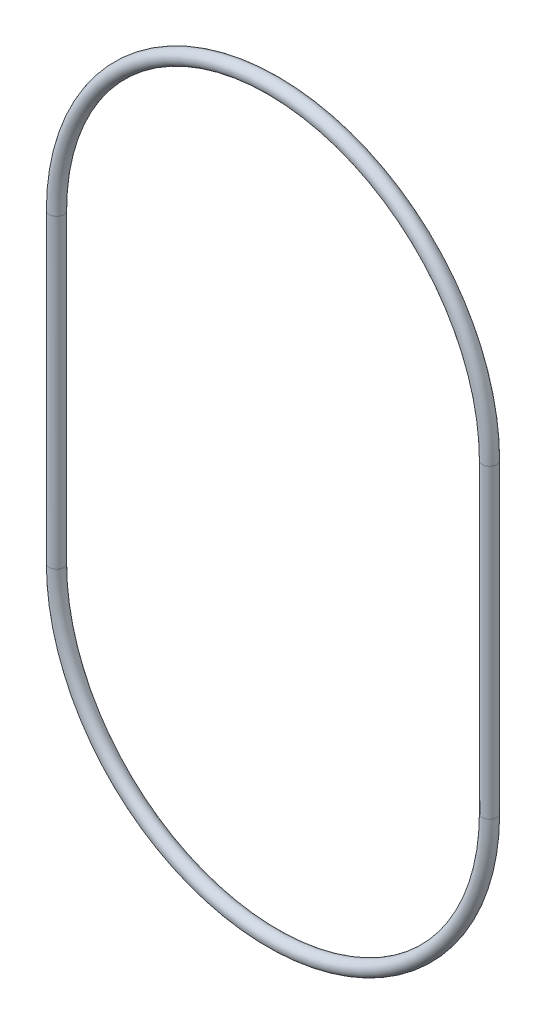
ISO-10303-21;
HEADER;
FILE_DESCRIPTION(('STEP AP214'),'2;1');
FILE_NAME('part.step','',(''),(''),'','','');
FILE_SCHEMA(('AUTOMOTIVE_DESIGN { 1 0 10303 214 1 1 1 1 }'));
ENDSEC;
DATA;
#1=APPLICATION_CONTEXT('core data for automotive mechanical design processes');
#2=APPLICATION_PROTOCOL_DEFINITION('international standard','automotive_design',2000,#1);
#3=PRODUCT_CONTEXT('',#1,'mechanical');
#4=PRODUCT('Part','Part','',(#3));
#5=PRODUCT_RELATED_PRODUCT_CATEGORY('part','',(#4));
#6=PRODUCT_DEFINITION_FORMATION('','',#4);
#7=PRODUCT_DEFINITION_CONTEXT('part definition',#1,'design');
#8=PRODUCT_DEFINITION('design','',#6,#7);
#9=PRODUCT_DEFINITION_SHAPE('','',#8);
#10=(LENGTH_UNIT() NAMED_UNIT(*) SI_UNIT(.MILLI.,.METRE.));
#11=(NAMED_UNIT(*) PLANE_ANGLE_UNIT() SI_UNIT($,.RADIAN.));
#12=(NAMED_UNIT(*) SI_UNIT($,.STERADIAN.) SOLID_ANGLE_UNIT());
#13=UNCERTAINTY_MEASURE_WITH_UNIT(LENGTH_MEASURE(1.E-05),#10,'distance_accuracy_value','');
#14=(GEOMETRIC_REPRESENTATION_CONTEXT(3) GLOBAL_UNCERTAINTY_ASSIGNED_CONTEXT((#13)) GLOBAL_UNIT_ASSIGNED_CONTEXT((#10,
#11,#12)) REPRESENTATION_CONTEXT('',''));
#15=CARTESIAN_POINT('',(0.,0.,0.));
#16=DIRECTION('',(0.,0.,1.));
#17=DIRECTION('',(1.,0.,0.));
#18=AXIS2_PLACEMENT_3D('',#15,#16,#17);
#19=CARTESIAN_POINT('',(0.,0.,0.));
#20=DIRECTION('',(0.,0.,-1.));
#21=DIRECTION('',(-1.,0.,0.));
#22=AXIS2_PLACEMENT_3D('',#19,#20,#21);
#23=TOROIDAL_SURFACE('',#22,34.,1.125);
#24=CARTESIAN_POINT('',(-34.,0.,0.));
#25=DIRECTION('',(0.,-1.,0.));
#26=DIRECTION('',(0.,0.,1.));
#27=AXIS2_PLACEMENT_3D('',#24,#25,#26);
#28=CIRCLE('',#27,1.125);
#29=CARTESIAN_POINT('',(-34.,0.,1.125));
#30=VERTEX_POINT('',#29);
#31=EDGE_CURVE('E41',#30,#30,#28,.T.);
#32=ORIENTED_EDGE('',*,*,#31,.F.);
#33=EDGE_LOOP('',(#32));
#34=FACE_BOUND('',#33,.T.);
#35=CARTESIAN_POINT('',(34.,0.,1.125));
#36=CARTESIAN_POINT('',(34.0184077880435,0.,1.12500039047487));
#37=CARTESIAN_POINT('',(34.0368155428614,0.,1.12454821926579));
#38=CARTESIAN_POINT('',(34.0735867243753,0.,1.12274155719584));
#39=CARTESIAN_POINT('',(34.0919501510712,0.,1.12138706633496));
#40=CARTESIAN_POINT('',(34.1285884146703,0.,1.11777856867748));
#41=CARTESIAN_POINT('',(34.1468632515735,0.,1.11552456188088));
#42=CARTESIAN_POINT('',(34.1832803159511,0.,1.11012258553987));
#43=CARTESIAN_POINT('',(34.2014225434256,0.,1.10697461599545));
#44=CARTESIAN_POINT('',(34.2375306811107,0.,1.09979226491181));
#45=CARTESIAN_POINT('',(34.2554965913212,0.,1.09575788337258));
#46=CARTESIAN_POINT('',(34.2912088134611,0.,1.08681243631514));
#47=CARTESIAN_POINT('',(34.3089551253905,0.,1.08190137079692));
#48=CARTESIAN_POINT('',(34.344185398432,0.,1.07121438460054));
#49=CARTESIAN_POINT('',(34.3616693595441,0.,1.06543846392238));
#50=CARTESIAN_POINT('',(34.3963328105884,0.,1.05303568273941));
#51=CARTESIAN_POINT('',(34.4135123005206,0.,1.04640882223462));
#52=CARTESIAN_POINT('',(34.4475254223008,0.,1.03232012591577));
#53=CARTESIAN_POINT('',(34.4643590541488,0.,1.02485829010173));
#54=CARTESIAN_POINT('',(34.4976399060693,0.,1.00911761942601));
#55=CARTESIAN_POINT('',(34.5140871261417,0.,1.00083878456433));
#56=CARTESIAN_POINT('',(34.5465555317167,0.,0.983484060219461));
#57=CARTESIAN_POINT('',(34.5625767172193,0.,0.974408170736265));
#58=CARTESIAN_POINT('',(34.5941544572155,0.,0.955481201764344));
#59=CARTESIAN_POINT('',(34.6097110117091,0.,0.945630122275619));
#60=CARTESIAN_POINT('',(34.640322012585,0.,0.925176505405105));
#61=CARTESIAN_POINT('',(34.6553764589673,0.,0.914573968023315));
#62=CARTESIAN_POINT('',(34.6849469761407,0.,0.892642977808132));
#63=CARTESIAN_POINT('',(34.6994630469317,0.,0.881314524974739));
#64=CARTESIAN_POINT('',(34.7279218424365,0.,0.857958995091416));
#65=CARTESIAN_POINT('',(34.7418645671503,0.,0.845931918041485));
#66=CARTESIAN_POINT('',(34.7691430812555,0.,0.821208114007168));
#67=CARTESIAN_POINT('',(34.7824788706469,0.,0.808511387022781));
#68=CARTESIAN_POINT('',(34.8085113870228,0.,0.782478870646949));
#69=CARTESIAN_POINT('',(34.8212081140072,0.,0.769143081255504));
#70=CARTESIAN_POINT('',(34.8459319180415,0.,0.741864567150283));
#71=CARTESIAN_POINT('',(34.8579589950914,0.,0.727921842436507));
#72=CARTESIAN_POINT('',(34.8813145249747,0.,0.699463046931693));
#73=CARTESIAN_POINT('',(34.8926429778082,0.,0.684946976140655));
#74=CARTESIAN_POINT('',(34.9145739680233,0.,0.655376458967316));
#75=CARTESIAN_POINT('',(34.9251765054051,0.,0.640322012585014));
#76=CARTESIAN_POINT('',(34.9456301222757,0.,0.60971101170909));
#77=CARTESIAN_POINT('',(34.9554812017645,0.,0.594154457215468));
#78=CARTESIAN_POINT('',(34.9744081707361,0.,0.562576717219277));
#79=CARTESIAN_POINT('',(34.9834840602187,0.,0.546555531716708));
#80=CARTESIAN_POINT('',(35.0008387845651,0.,0.514087126141785));
#81=CARTESIAN_POINT('',(35.0091176194288,0.,0.497639906069431));
#82=CARTESIAN_POINT('',(35.0248582900989,0.,0.464359054148701));
#83=CARTESIAN_POINT('',(35.0323201259054,0.,0.447525422300326));
#84=CARTESIAN_POINT('',(35.046408822245,0.,0.413512300521125));
#85=CARTESIAN_POINT('',(35.0530356827781,0.,0.396332810590301));
#86=CARTESIAN_POINT('',(35.0654384638837,0.,0.361669359542193));
#87=CARTESIAN_POINT('',(35.071214384456,0.,0.34418539842491));
#88=CARTESIAN_POINT('',(35.0819013709414,0.,0.30895512539763));
#89=CARTESIAN_POINT('',(35.0868124368545,0.,0.291208813487633));
#90=CARTESIAN_POINT('',(35.0957578828332,0.,0.25549659129471));
#91=CARTESIAN_POINT('',(35.099792262899,0.,0.237530681011784));
#92=CARTESIAN_POINT('',(35.1069746180083,0.,0.201422543524504));
#93=CARTESIAN_POINT('',(35.1101225930518,0.,0.183280316320148));
#94=CARTESIAN_POINT('',(35.115524554369,0.,0.146863251204415));
#95=CARTESIAN_POINT('',(35.1177785406426,0.,0.128588413293037));
#96=CARTESIAN_POINT('',(35.1213870943698,0.,0.0919501524484736));
#97=CARTESIAN_POINT('',(35.1227416618233,0.,0.0735867295152883));
#98=CARTESIAN_POINT('',(35.1245481146384,0.,0.036815537721402));
#99=CARTESIAN_POINT('',(35.125,0.,0.018407768860701));
#100=CARTESIAN_POINT('',(35.125,0.,-0.018407768860701));
#101=CARTESIAN_POINT('',(35.1245481146384,0.,-0.036815537721402));
#102=CARTESIAN_POINT('',(35.1227416618233,0.,-0.0735867295152883));
#103=CARTESIAN_POINT('',(35.1213870943698,0.,-0.0919501524484736));
#104=CARTESIAN_POINT('',(35.1177785406426,0.,-0.128588413293037));
#105=CARTESIAN_POINT('',(35.115524554369,0.,-0.146863251204415));
#106=CARTESIAN_POINT('',(35.1101225930518,0.,-0.183280316320148));
#107=CARTESIAN_POINT('',(35.1069746180083,0.,-0.201422543524504));
#108=CARTESIAN_POINT('',(35.099792262899,0.,-0.237530681011784));
#109=CARTESIAN_POINT('',(35.0957578828332,0.,-0.25549659129471));
#110=CARTESIAN_POINT('',(35.0868124368545,0.,-0.291208813487633));
#111=CARTESIAN_POINT('',(35.0819013709414,0.,-0.30895512539763));
#112=CARTESIAN_POINT('',(35.071214384456,0.,-0.34418539842491));
#113=CARTESIAN_POINT('',(35.0654384638837,0.,-0.361669359542193));
#114=CARTESIAN_POINT('',(35.0530356827781,0.,-0.396332810590301));
#115=CARTESIAN_POINT('',(35.046408822245,0.,-0.413512300521125));
#116=CARTESIAN_POINT('',(35.0323201259054,0.,-0.447525422300326));
#117=CARTESIAN_POINT('',(35.0248582900989,0.,-0.464359054148701));
#118=CARTESIAN_POINT('',(35.0091176194288,0.,-0.497639906069431));
#119=CARTESIAN_POINT('',(35.0008387845651,0.,-0.514087126141785));
#120=CARTESIAN_POINT('',(34.9834840602187,0.,-0.546555531716708));
#121=CARTESIAN_POINT('',(34.9744081707361,0.,-0.562576717219277));
#122=CARTESIAN_POINT('',(34.9554812017645,0.,-0.594154457215468));
#123=CARTESIAN_POINT('',(34.9456301222757,0.,-0.60971101170909));
#124=CARTESIAN_POINT('',(34.9251765054051,0.,-0.640322012585014));
#125=CARTESIAN_POINT('',(34.9145739680233,0.,-0.655376458967315));
#126=CARTESIAN_POINT('',(34.8926429778082,0.,-0.684946976140655));
#127=CARTESIAN_POINT('',(34.8813145249747,0.,-0.699463046931693));
#128=CARTESIAN_POINT('',(34.8579589950914,0.,-0.727921842436508));
#129=CARTESIAN_POINT('',(34.8459319180415,0.,-0.741864567150283));
#130=CARTESIAN_POINT('',(34.8212081140072,0.,-0.769143081255504));
#131=CARTESIAN_POINT('',(34.8085113870228,0.,-0.782478870646949));
#132=CARTESIAN_POINT('',(34.7824788706469,0.,-0.808511387022781));
#133=CARTESIAN_POINT('',(34.7691430812555,0.,-0.821208114007169));
#134=CARTESIAN_POINT('',(34.7418645671503,0.,-0.845931918041485));
#135=CARTESIAN_POINT('',(34.7279218424365,0.,-0.857958995091412));
#136=CARTESIAN_POINT('',(34.6994630469317,0.,-0.881314524974743));
#137=CARTESIAN_POINT('',(34.6849469761407,0.,-0.892642977808147));
#138=CARTESIAN_POINT('',(34.6553764589673,0.,-0.914573968023301));
#139=CARTESIAN_POINT('',(34.640322012585,0.,-0.925176505405051));
#140=CARTESIAN_POINT('',(34.6097110117091,0.,-0.945630122275673));
#141=CARTESIAN_POINT('',(34.5941544572155,0.,-0.955481201764544));
#142=CARTESIAN_POINT('',(34.5625767172193,0.,-0.974408170736066));
#143=CARTESIAN_POINT('',(34.5465555317167,0.,-0.983484060218716));
#144=CARTESIAN_POINT('',(34.5140871261418,0.,-1.00083878456508));
#145=CARTESIAN_POINT('',(34.4976399060694,0.,-1.00911761942879));
#146=CARTESIAN_POINT('',(34.4643590541487,0.,-1.02485829009895));
#147=CARTESIAN_POINT('',(34.4475254223003,0.,-1.0323201259054));
#148=CARTESIAN_POINT('',(34.4135123005211,0.,-1.04640882224499));
#149=CARTESIAN_POINT('',(34.3963328105903,0.,-1.05303568277814));
#150=CARTESIAN_POINT('',(34.3616693595422,0.,-1.06543846388366));
#151=CARTESIAN_POINT('',(34.3441853984249,0.,-1.07121438445603));
#152=CARTESIAN_POINT('',(34.3089551253976,0.,-1.08190137094144));
#153=CARTESIAN_POINT('',(34.2912088134876,0.,-1.08681243685447));
#154=CARTESIAN_POINT('',(34.2554965912947,0.,-1.09575788283325));
#155=CARTESIAN_POINT('',(34.2375306810118,0.,-1.099792262899));
#156=CARTESIAN_POINT('',(34.2014225435245,0.,-1.10697461800826));
#157=CARTESIAN_POINT('',(34.1832803163202,0.,-1.11012259305178));
#158=CARTESIAN_POINT('',(34.1468632512044,0.,-1.11552455436897));
#159=CARTESIAN_POINT('',(34.128588413293,0.,-1.11777854064265));
#160=CARTESIAN_POINT('',(34.0919501524485,0.,-1.12138709436979));
#161=CARTESIAN_POINT('',(34.0735867295153,0.,-1.12274166182327));
#162=CARTESIAN_POINT('',(34.0368155377214,0.,-1.12454811463837));
#163=CARTESIAN_POINT('',(34.0184077688607,0.,-1.125));
#164=CARTESIAN_POINT('',(33.9815922311393,0.,-1.125));
#165=CARTESIAN_POINT('',(33.9631844622786,0.,-1.12454811463837));
#166=CARTESIAN_POINT('',(33.9264132704847,0.,-1.12274166182327));
#167=CARTESIAN_POINT('',(33.9080498475515,0.,-1.12138709436979));
#168=CARTESIAN_POINT('',(33.871411586707,0.,-1.11777854064265));
#169=CARTESIAN_POINT('',(33.8531367487956,0.,-1.11552455436897));
#170=CARTESIAN_POINT('',(33.8167196836799,0.,-1.11012259305178));
#171=CARTESIAN_POINT('',(33.7985774564755,0.,-1.10697461800826));
#172=CARTESIAN_POINT('',(33.7624693189882,0.,-1.099792262899));
#173=CARTESIAN_POINT('',(33.7445034087053,0.,-1.09575788283325));
#174=CARTESIAN_POINT('',(33.7087911865124,0.,-1.08681243685447));
#175=CARTESIAN_POINT('',(33.6910448746024,0.,-1.08190137094144));
#176=CARTESIAN_POINT('',(33.6558146015751,0.,-1.07121438445603));
#177=CARTESIAN_POINT('',(33.6383306404578,0.,-1.06543846388366));
#178=CARTESIAN_POINT('',(33.6036671894097,0.,-1.05303568277814));
#179=CARTESIAN_POINT('',(33.5864876994789,0.,-1.04640882224499));
#180=CARTESIAN_POINT('',(33.5524745776997,0.,-1.0323201259054));
#181=CARTESIAN_POINT('',(33.5356409458513,0.,-1.02485829009895));
#182=CARTESIAN_POINT('',(33.5023600939306,0.,-1.00911761942879));
#183=CARTESIAN_POINT('',(33.4859128738582,0.,-1.00083878456508));
#184=CARTESIAN_POINT('',(33.4534444682833,0.,-0.983484060218716));
#185=CARTESIAN_POINT('',(33.4374232827807,0.,-0.974408170736066));
#186=CARTESIAN_POINT('',(33.4058455427845,0.,-0.955481201764544));
#187=CARTESIAN_POINT('',(33.3902889882909,0.,-0.945630122275673));
#188=CARTESIAN_POINT('',(33.359677987415,0.,-0.925176505405051));
#189=CARTESIAN_POINT('',(33.3446235410327,0.,-0.914573968023301));
#190=CARTESIAN_POINT('',(33.3150530238593,0.,-0.892642977808147));
#191=CARTESIAN_POINT('',(33.3005369530683,0.,-0.881314524974743));
#192=CARTESIAN_POINT('',(33.2720781575635,0.,-0.857958995091412));
#193=CARTESIAN_POINT('',(33.2581354328497,0.,-0.845931918041484));
#194=CARTESIAN_POINT('',(33.2308569187445,0.,-0.821208114007169));
#195=CARTESIAN_POINT('',(33.2175211293531,0.,-0.808511387022781));
#196=CARTESIAN_POINT('',(33.1914886129772,0.,-0.782478870646949));
#197=CARTESIAN_POINT('',(33.1787918859928,0.,-0.769143081255505));
#198=CARTESIAN_POINT('',(33.1540680819585,0.,-0.741864567150284));
#199=CARTESIAN_POINT('',(33.1420410049086,0.,-0.727921842436507));
#200=CARTESIAN_POINT('',(33.1186854750253,0.,-0.699463046931693));
#201=CARTESIAN_POINT('',(33.1073570221919,0.,-0.684946976140655));
#202=CARTESIAN_POINT('',(33.0854260319767,0.,-0.655376458967316));
#203=CARTESIAN_POINT('',(33.074823494595,0.,-0.640322012585014));
#204=CARTESIAN_POINT('',(33.0543698777243,0.,-0.60971101170909));
#205=CARTESIAN_POINT('',(33.0445187982355,0.,-0.594154457215468));
#206=CARTESIAN_POINT('',(33.0255918292639,0.,-0.562576717219277));
#207=CARTESIAN_POINT('',(33.0165159397813,0.,-0.546555531716709));
#208=CARTESIAN_POINT('',(32.9991612154349,0.,-0.514087126141785));
#209=CARTESIAN_POINT('',(32.9908823805712,0.,-0.497639906069431));
#210=CARTESIAN_POINT('',(32.9751417099011,0.,-0.464359054148701));
#211=CARTESIAN_POINT('',(32.9676798740946,0.,-0.447525422300326));
#212=CARTESIAN_POINT('',(32.953591177755,0.,-0.413512300521126));
#213=CARTESIAN_POINT('',(32.9469643172219,0.,-0.396332810590301));
#214=CARTESIAN_POINT('',(32.9345615361163,0.,-0.361669359542193));
#215=CARTESIAN_POINT('',(32.928785615544,0.,-0.34418539842491));
#216=CARTESIAN_POINT('',(32.9180986290586,0.,-0.30895512539763));
#217=CARTESIAN_POINT('',(32.9131875631455,0.,-0.291208813487633));
#218=CARTESIAN_POINT('',(32.9042421171668,0.,-0.25549659129471));
#219=CARTESIAN_POINT('',(32.900207737101,0.,-0.237530681011784));
#220=CARTESIAN_POINT('',(32.8930253819917,0.,-0.201422543524503));
#221=CARTESIAN_POINT('',(32.8898774069482,0.,-0.183280316320148));
#222=CARTESIAN_POINT('',(32.884475445631,0.,-0.146863251204415));
#223=CARTESIAN_POINT('',(32.8822214593574,0.,-0.128588413293037));
#224=CARTESIAN_POINT('',(32.8786129056302,0.,-0.0919501524484738));
#225=CARTESIAN_POINT('',(32.8772583381767,0.,-0.0735867295152884));
#226=CARTESIAN_POINT('',(32.8754518853616,0.,-0.036815537721402));
#227=CARTESIAN_POINT('',(32.875,0.,-0.0184077688607011));
#228=CARTESIAN_POINT('',(32.875,0.,0.0184077688607008));
#229=CARTESIAN_POINT('',(32.8754518853616,0.,0.0368155377214017));
#230=CARTESIAN_POINT('',(32.8772583381767,0.,0.0735867295152881));
#231=CARTESIAN_POINT('',(32.8786129056302,0.,0.0919501524484736));
#232=CARTESIAN_POINT('',(32.8822214593574,0.,0.128588413293037));
#233=CARTESIAN_POINT('',(32.884475445631,0.,0.146863251204415));
#234=CARTESIAN_POINT('',(32.8898774069482,0.,0.183280316320148));
#235=CARTESIAN_POINT('',(32.8930253819917,0.,0.201422543524503));
#236=CARTESIAN_POINT('',(32.900207737101,0.,0.237530681011784));
#237=CARTESIAN_POINT('',(32.9042421171668,0.,0.25549659129471));
#238=CARTESIAN_POINT('',(32.9131875631455,0.,0.291208813487632));
#239=CARTESIAN_POINT('',(32.9180986290586,0.,0.308955125397629));
#240=CARTESIAN_POINT('',(32.928785615544,0.,0.34418539842491));
#241=CARTESIAN_POINT('',(32.9345615361163,0.,0.361669359542193));
#242=CARTESIAN_POINT('',(32.9469643172219,0.,0.396332810590301));
#243=CARTESIAN_POINT('',(32.953591177755,0.,0.413512300521125));
#244=CARTESIAN_POINT('',(32.9676798740946,0.,0.447525422300326));
#245=CARTESIAN_POINT('',(32.9751417099011,0.,0.464359054148701));
#246=CARTESIAN_POINT('',(32.9908823805712,0.,0.497639906069431));
#247=CARTESIAN_POINT('',(32.9991612154349,0.,0.514087126141785));
#248=CARTESIAN_POINT('',(33.0165159397813,0.,0.546555531716708));
#249=CARTESIAN_POINT('',(33.0255918292639,0.,0.562576717219277));
#250=CARTESIAN_POINT('',(33.0445187982355,0.,0.594154457215468));
#251=CARTESIAN_POINT('',(33.0543698777243,0.,0.60971101170909));
#252=CARTESIAN_POINT('',(33.074823494595,0.,0.640322012585014));
#253=CARTESIAN_POINT('',(33.0854260319767,0.,0.655376458967316));
#254=CARTESIAN_POINT('',(33.1073570221919,0.,0.684946976140655));
#255=CARTESIAN_POINT('',(33.1186854750253,0.,0.699463046931693));
#256=CARTESIAN_POINT('',(33.1420410049086,0.,0.727921842436507));
#257=CARTESIAN_POINT('',(33.1540680819585,0.,0.741864567150283));
#258=CARTESIAN_POINT('',(33.1787918859928,0.,0.769143081255504));
#259=CARTESIAN_POINT('',(33.1914886129772,0.,0.782478870646948));
#260=CARTESIAN_POINT('',(33.2175211293531,0.,0.808511387022781));
#261=CARTESIAN_POINT('',(33.2308569187445,0.,0.821208114007169));
#262=CARTESIAN_POINT('',(33.2581354328497,0.,0.845931918041487));
#263=CARTESIAN_POINT('',(33.2720781575635,0.,0.857958995091415));
#264=CARTESIAN_POINT('',(33.3005369530683,0.,0.881314524974738));
#265=CARTESIAN_POINT('',(33.3150530238593,0.,0.892642977808132));
#266=CARTESIAN_POINT('',(33.3446235410327,0.,0.914573968023315));
#267=CARTESIAN_POINT('',(33.359677987415,0.,0.925176505405104));
#268=CARTESIAN_POINT('',(33.3902889882909,0.,0.945630122275619));
#269=CARTESIAN_POINT('',(33.4058455427845,0.,0.955481201764344));
#270=CARTESIAN_POINT('',(33.4374232827807,0.,0.974408170736265));
#271=CARTESIAN_POINT('',(33.4534444682833,0.,0.983484060219461));
#272=CARTESIAN_POINT('',(33.4859128738583,0.,1.00083878456433));
#273=CARTESIAN_POINT('',(33.5023600939307,0.,1.00911761942601));
#274=CARTESIAN_POINT('',(33.5356409458512,0.,1.02485829010173));
#275=CARTESIAN_POINT('',(33.5524745776992,0.,1.03232012591578));
#276=CARTESIAN_POINT('',(33.5864876994794,0.,1.04640882223462));
#277=CARTESIAN_POINT('',(33.6036671894116,0.,1.05303568273941));
#278=CARTESIAN_POINT('',(33.6383306404559,0.,1.06543846392238));
#279=CARTESIAN_POINT('',(33.655814601568,0.,1.07121438460054));
#280=CARTESIAN_POINT('',(33.6910448746095,0.,1.08190137079692));
#281=CARTESIAN_POINT('',(33.7087911865389,0.,1.08681243631514));
#282=CARTESIAN_POINT('',(33.7445034086788,0.,1.09575788337258));
#283=CARTESIAN_POINT('',(33.7624693188893,0.,1.09979226491181));
#284=CARTESIAN_POINT('',(33.7985774565744,0.,1.10697461599545));
#285=CARTESIAN_POINT('',(33.8167196840489,0.,1.11012258553987));
#286=CARTESIAN_POINT('',(33.8531367484266,0.,1.11552456188088));
#287=CARTESIAN_POINT('',(33.8714115853297,0.,1.11777856867748));
#288=CARTESIAN_POINT('',(33.9080498489288,0.,1.12138706633496));
#289=CARTESIAN_POINT('',(33.9264132756247,0.,1.12274155719584));
#290=CARTESIAN_POINT('',(33.9631844571386,0.,1.12454821926579));
#291=CARTESIAN_POINT('',(33.9815922119565,0.,1.12500039047487));
#292=CARTESIAN_POINT('',(34.,0.,1.125));
#293=B_SPLINE_CURVE_WITH_KNOTS('',3,(#35,#36,#37,#38,#39,#40,#41,#42,#43,#44,#45,#46,#47,#48,
#49,#50,#51,#52,#53,#54,#55,#56,#57,#58,#59,#60,#61,#62,#63,#64,#65,#66,#67,#68,#69,#70,#71,#72,
#73,#74,#75,#76,#77,#78,#79,#80,#81,#82,#83,#84,#85,#86,#87,#88,#89,#90,#91,#92,#93,#94,#95,#96,
#97,#98,#99,#100,#101,#102,#103,#104,#105,#106,#107,#108,#109,#110,#111,#112,#113,#114,#115,
#116,#117,#118,#119,#120,#121,#122,#123,#124,#125,#126,#127,#128,#129,#130,#131,#132,#133,#134,
#135,#136,#137,#138,#139,#140,#141,#142,#143,#144,#145,#146,#147,#148,#149,#150,#151,#152,#153,
#154,#155,#156,#157,#158,#159,#160,#161,#162,#163,#164,#165,#166,#167,#168,#169,#170,#171,#172,
#173,#174,#175,#176,#177,#178,#179,#180,#181,#182,#183,#184,#185,#186,#187,#188,#189,#190,#191,
#192,#193,#194,#195,#196,#197,#198,#199,#200,#201,#202,#203,#204,#205,#206,#207,#208,#209,#210,
#211,#212,#213,#214,#215,#216,#217,#218,#219,#220,#221,#222,#223,#224,#225,#226,#227,#228,#229,
#230,#231,#232,#233,#234,#235,#236,#237,#238,#239,#240,#241,#242,#243,#244,#245,#246,#247,#248,
#249,#250,#251,#252,#253,#254,#255,#256,#257,#258,#259,#260,#261,#262,#263,#264,#265,#266,#267,
#268,#269,#270,#271,#272,#273,#274,#275,#276,#277,#278,#279,#280,#281,#282,#283,#284,#285,#286,
#287,#288,#289,#290,#291,#292),.UNSPECIFIED.,.F.,.F.,(4,2,2,2,2,2,2,2,2,2,2,2,2,2,2,2,2,2,2,2,2,
2,2,2,2,2,2,2,2,2,2,2,2,2,2,2,2,2,2,2,2,2,2,2,2,2,2,2,2,2,2,2,2,2,2,2,2,2,2,2,2,2,2,2,2,2,2,2,2,
2,2,2,2,2,2,2,2,2,2,2,2,2,2,2,2,2,2,2,2,2,2,2,2,2,2,2,2,2,2,2,2,2,2,2,2,2,2,2,2,2,2,2,2,2,2,2,2,
2,2,2,2,2,2,2,2,2,2,2,4),(0.,0.0552177641765507,0.110435528353107,0.165653292529656,
0.220871056706208,0.276088820882762,0.331306585059314,0.38652434923587,0.44174211341242,
0.496959877588973,0.552177641765524,0.60739540594208,0.662613170118632,0.717830934295181,
0.773048698471733,0.828266462648286,0.883484226824842,0.938701991001392,0.993919755177946,
1.0491375193545,1.10435528353105,1.1595730477076,1.21479081188416,1.27000857606071,
1.32522634023726,1.38044410441381,1.43566186859037,1.49087963276692,1.54609739694347,
1.60131516112002,1.65653292529658,1.71175068947313,1.76696845364968,1.82218621782623,
1.87740398200279,1.93262174617934,1.98783951035589,2.04305727453244,2.098275038709,
2.15349280288555,2.2087105670621,2.26392833123866,2.31914609541521,2.37436385959176,
2.42958162376831,2.48479938794487,2.54001715212142,2.59523491629797,2.65045268047452,
2.70567044465108,2.76088820882763,2.81610597300418,2.87132373718073,2.92654150135728,
2.98175926553384,3.03697702971039,3.09219479388694,3.14741255806349,3.20263032224005,
3.2578480864166,3.31306585059315,3.36828361476971,3.42350137894625,3.47871914312281,
3.53393690729936,3.58915467147591,3.64437243565247,3.69959019982902,3.75480796400557,
3.81002572818212,3.86524349235868,3.92046125653523,3.97567902071178,4.03089678488834,
4.08611454906489,4.14133231324144,4.19655007741799,4.25176784159454,4.30698560577109,
4.36220336994765,4.4174211341242,4.47263889830075,4.52785666247731,4.58307442665386,
4.63829219083041,4.69350995500696,4.74872771918352,4.80394548336007,4.85916324753662,
4.91438101171317,4.96959877588973,5.02481654006628,5.08003430424283,5.13525206841938,
5.19046983259594,5.24568759677249,5.30090536094904,5.35612312512559,5.41134088930215,
5.4665586534787,5.52177641765525,5.5769941818318,5.63221194600836,5.68742971018491,
5.74264747436146,5.79786523853801,5.85308300271457,5.90830076689112,5.96351853106767,
6.01873629524423,6.07395405942078,6.12917182359733,6.18438958777388,6.23960735195043,
6.29482511612699,6.35004288030354,6.40526064448009,6.46047840865664,6.5156961728332,
6.57091393700975,6.6261317011863,6.68134946536285,6.73656722953941,6.79178499371596,
6.84700275789251,6.90222052206907,6.95743828624562,7.01265605042217,7.06787381459872),.UNSPECIFIED.);
#294=CARTESIAN_POINT('',(34.,0.,1.125));
#295=VERTEX_POINT('',#294);
#296=EDGE_CURVE('E10',#295,#295,#293,.T.);
#297=ORIENTED_EDGE('',*,*,#296,.T.);
#298=EDGE_LOOP('',(#297));
#299=FACE_BOUND('',#298,.T.);
#300=ADVANCED_FACE('F31',(#34,#299),#23,.T.);
#301=CARTESIAN_POINT('',(-34.,-48.,0.));
#302=DIRECTION('',(0.,1.,0.));
#303=DIRECTION('',(-1.,0.,0.));
#304=AXIS2_PLACEMENT_3D('',#301,#302,#303);
#305=CYLINDRICAL_SURFACE('',#304,1.125);
#306=CARTESIAN_POINT('',(-34.,-48.,0.));
#307=DIRECTION('',(0.,-1.,0.));
#308=DIRECTION('',(0.,0.,1.));
#309=AXIS2_PLACEMENT_3D('',#306,#307,#308);
#310=CIRCLE('',#309,1.125);
#311=CARTESIAN_POINT('',(-35.125,-48.,0.));
#312=VERTEX_POINT('',#311);
#313=EDGE_CURVE('E46',#312,#312,#310,.T.);
#314=ORIENTED_EDGE('',*,*,#313,.F.);
#315=EDGE_LOOP('',(#314));
#316=FACE_BOUND('',#315,.T.);
#317=ORIENTED_EDGE('',*,*,#31,.T.);
#318=EDGE_LOOP('',(#317));
#319=FACE_BOUND('',#318,.T.);
#320=ADVANCED_FACE('F70',(#316,#319),#305,.T.);
#321=CARTESIAN_POINT('',(0.,-48.,0.));
#322=DIRECTION('',(0.,0.,-1.));
#323=DIRECTION('',(-1.,0.,0.));
#324=AXIS2_PLACEMENT_3D('',#321,#322,#323);
#325=TOROIDAL_SURFACE('',#324,34.,1.125);
#326=CARTESIAN_POINT('',(34.,-48.,0.));
#327=DIRECTION('',(0.,1.,0.));
#328=DIRECTION('',(0.,0.,1.));
#329=AXIS2_PLACEMENT_3D('',#326,#327,#328);
#330=CIRCLE('',#329,1.125);
#331=CARTESIAN_POINT('',(35.125,-48.,0.));
#332=VERTEX_POINT('',#331);
#333=EDGE_CURVE('E51',#332,#332,#330,.T.);
#334=CARTESIAN_POINT('',(0.,-48.,0.));
#335=DIRECTION('',(0.,0.,-1.));
#336=DIRECTION('',(-1.,0.,0.));
#337=AXIS2_PLACEMENT_3D('',#334,#335,#336);
#338=CIRCLE('',#337,35.125);
#339=EDGE_CURVE('',#332,#312,#338,.T.);
#340=ORIENTED_EDGE('',*,*,#333,.F.);
#341=ORIENTED_EDGE('',*,*,#313,.T.);
#342=ORIENTED_EDGE('',*,*,#339,.T.);
#343=ORIENTED_EDGE('',*,*,#339,.F.);
#344=EDGE_LOOP('',(#340,#342,#341,#343));
#345=FACE_BOUND('',#344,.T.);
#346=ADVANCED_FACE('F65',(#345),#325,.T.);
#347=CARTESIAN_POINT('',(34.,-48.,0.));
#348=DIRECTION('',(0.,1.,0.));
#349=DIRECTION('',(-1.,0.,0.));
#350=AXIS2_PLACEMENT_3D('',#347,#348,#349);
#351=CYLINDRICAL_SURFACE('',#350,1.125);
#352=ORIENTED_EDGE('',*,*,#333,.T.);
#353=EDGE_LOOP('',(#352));
#354=FACE_BOUND('',#353,.T.);
#355=ORIENTED_EDGE('',*,*,#296,.F.);
#356=EDGE_LOOP('',(#355));
#357=FACE_BOUND('',#356,.T.);
#358=ADVANCED_FACE('F63',(#354,#357),#351,.T.);
#359=CLOSED_SHELL('',(#300,#320,#346,#358));
#360=MANIFOLD_SOLID_BREP('B2',#359);
#361=ADVANCED_BREP_SHAPE_REPRESENTATION('',(#18,#360),#14);
#362=SHAPE_DEFINITION_REPRESENTATION(#9,#361);
ENDSEC;
END-ISO-10303-21;
